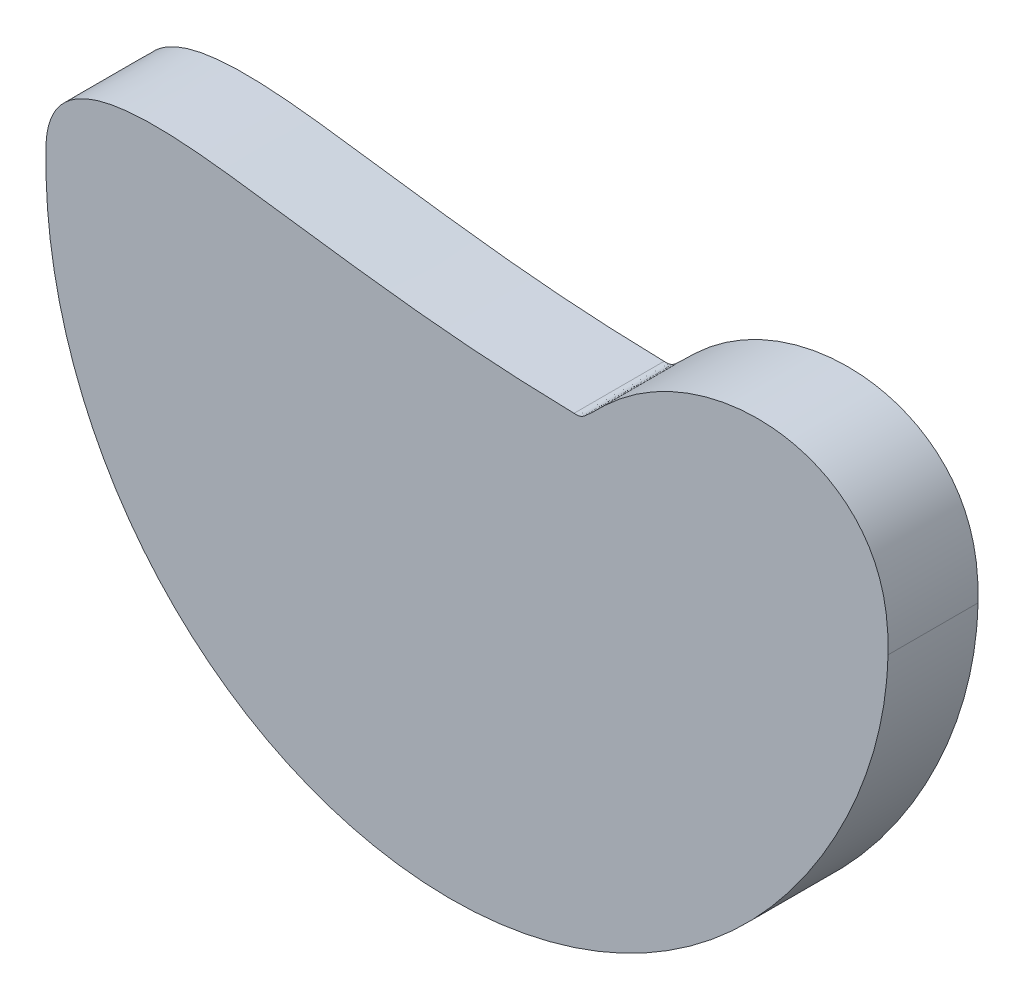
ISO-10303-21;
HEADER;
FILE_DESCRIPTION(('STEP AP214'),'2;1');
FILE_NAME('part.step','',(''),(''),'','','');
FILE_SCHEMA(('AUTOMOTIVE_DESIGN { 1 0 10303 214 1 1 1 1 }'));
ENDSEC;
DATA;
#1=APPLICATION_CONTEXT('core data for automotive mechanical design processes');
#2=APPLICATION_PROTOCOL_DEFINITION('international standard','automotive_design',2000,#1);
#3=PRODUCT_CONTEXT('',#1,'mechanical');
#4=PRODUCT('Part','Part','',(#3));
#5=PRODUCT_RELATED_PRODUCT_CATEGORY('part','',(#4));
#6=PRODUCT_DEFINITION_FORMATION('','',#4);
#7=PRODUCT_DEFINITION_CONTEXT('part definition',#1,'design');
#8=PRODUCT_DEFINITION('design','',#6,#7);
#9=PRODUCT_DEFINITION_SHAPE('','',#8);
#10=(LENGTH_UNIT() NAMED_UNIT(*) SI_UNIT(.MILLI.,.METRE.));
#11=(NAMED_UNIT(*) PLANE_ANGLE_UNIT() SI_UNIT($,.RADIAN.));
#12=(NAMED_UNIT(*) SI_UNIT($,.STERADIAN.) SOLID_ANGLE_UNIT());
#13=UNCERTAINTY_MEASURE_WITH_UNIT(LENGTH_MEASURE(1.E-05),#10,'distance_accuracy_value','');
#14=(GEOMETRIC_REPRESENTATION_CONTEXT(3) GLOBAL_UNCERTAINTY_ASSIGNED_CONTEXT((#13)) GLOBAL_UNIT_ASSIGNED_CONTEXT((#10,
#11,#12)) REPRESENTATION_CONTEXT('',''));
#15=CARTESIAN_POINT('',(0.,0.,0.));
#16=DIRECTION('',(0.,0.,1.));
#17=DIRECTION('',(1.,0.,0.));
#18=AXIS2_PLACEMENT_3D('',#15,#16,#17);
#19=CARTESIAN_POINT('',(0.177861844360574,9.82855438605498,20.));
#20=CARTESIAN_POINT('',(-24.6836923624119,10.4016354895508,20.));
#21=CARTESIAN_POINT('',(-51.7508193393782,13.9674637254268,20.));
#22=CARTESIAN_POINT('',(-116.674691622097,22.949464490572,20.));
#23=CARTESIAN_POINT('',(-117.145371573185,2.53030366212595,20.));
#24=B_SPLINE_CURVE_WITH_KNOTS('',3,(#19,#20,#21,#22,#23),.UNSPECIFIED.,.F.,.F.,(4,1,4),(0.,
0.578098364149226,1.),.UNSPECIFIED.);
#25=DIRECTION('',(0.,0.,-1.));
#26=VECTOR('',#25,1.);
#27=SURFACE_OF_LINEAR_EXTRUSION('',#24,#26);
#28=CARTESIAN_POINT('',(0.177861844360574,9.82855438605498,0.));
#29=CARTESIAN_POINT('',(-24.6836923624119,10.4016354895508,0.));
#30=CARTESIAN_POINT('',(-51.7508193393782,13.9674637254268,0.));
#31=CARTESIAN_POINT('',(-116.674691622097,22.949464490572,0.));
#32=CARTESIAN_POINT('',(-117.145371573185,2.53030366212595,0.));
#33=B_SPLINE_CURVE_WITH_KNOTS('',3,(#28,#29,#30,#31,#32),.UNSPECIFIED.,.F.,.F.,(4,1,4),(0.,
0.578098364149226,1.),.UNSPECIFIED.);
#34=CARTESIAN_POINT('',(0.177861842840825,9.82855438609001,0.));
#35=VERTEX_POINT('',#34);
#36=CARTESIAN_POINT('',(-117.145371573185,2.5303036621246,0.));
#37=VERTEX_POINT('',#36);
#38=EDGE_CURVE('E81',#35,#37,#33,.T.);
#39=ORIENTED_EDGE('',*,*,#38,.T.);
#40=DIRECTION('',(0.,0.,-1.));
#41=VECTOR('',#40,1.);
#42=CARTESIAN_POINT('',(-117.145371573185,2.5303036621246,20.));
#43=LINE('',#42,#41);
#44=CARTESIAN_POINT('',(-117.145371573185,2.5303036621246,20.));
#45=VERTEX_POINT('',#44);
#46=EDGE_CURVE('E11',#45,#37,#43,.T.);
#47=ORIENTED_EDGE('',*,*,#46,.F.);
#48=CARTESIAN_POINT('',(0.177861842840825,9.82855438609001,20.));
#49=VERTEX_POINT('',#48);
#50=EDGE_CURVE('E75',#49,#45,#24,.T.);
#51=ORIENTED_EDGE('',*,*,#50,.F.);
#52=DIRECTION('',(0.,0.,-1.));
#53=VECTOR('',#52,1.);
#54=CARTESIAN_POINT('',(0.177861842840825,9.82855438609001,20.));
#55=LINE('',#54,#53);
#56=EDGE_CURVE('E82',#49,#35,#55,.T.);
#57=ORIENTED_EDGE('',*,*,#56,.T.);
#58=EDGE_LOOP('',(#39,#47,#51,#57));
#59=FACE_BOUND('',#58,.T.);
#60=ADVANCED_FACE('F34',(#59),#27,.F.);
#61=CARTESIAN_POINT('',(-117.145371573185,2.5303036621246,20.));
#62=CARTESIAN_POINT('',(-117.148511626574,2.39408104441351,20.));
#63=CARTESIAN_POINT('',(-117.154264841567,2.1192397299448,20.));
#64=CARTESIAN_POINT('',(-117.163697582388,1.59627787590572,20.));
#65=CARTESIAN_POINT('',(-117.172306127851,0.919001208093309,20.));
#66=CARTESIAN_POINT('',(-117.177281387827,0.132679087831392,20.));
#67=CARTESIAN_POINT('',(-117.176524072155,-0.825004823361737,20.));
#68=CARTESIAN_POINT('',(-117.165431335051,-1.94736320312319,20.));
#69=CARTESIAN_POINT('',(-117.138383625471,-3.22414369874946,20.));
#70=CARTESIAN_POINT('',(-117.086762853282,-4.82314944663007,20.));
#71=CARTESIAN_POINT('',(-116.996001210809,-6.7389378139641,20.));
#72=CARTESIAN_POINT('',(-116.869036943858,-8.65391583544018,20.));
#73=CARTESIAN_POINT('',(-116.705494671698,-10.5652891244244,20.));
#74=CARTESIAN_POINT('',(-116.544690829488,-12.1561342168004,20.));
#75=CARTESIAN_POINT('',(-116.401268409165,-13.4270526002276,20.));
#76=CARTESIAN_POINT('',(-116.203453629686,-15.0136139345994,20.));
#77=CARTESIAN_POINT('',(-115.847254127427,-17.5468613935864,20.));
#78=CARTESIAN_POINT('',(-115.261475868583,-21.0158449663186,20.));
#79=CARTESIAN_POINT('',(-114.339794952761,-25.3982998589919,20.));
#80=CARTESIAN_POINT('',(-113.042751796319,-30.3493997291294,20.));
#81=CARTESIAN_POINT('',(-111.11524792372,-36.4499425298728,20.));
#82=CARTESIAN_POINT('',(-108.311650776112,-43.6019706937092,20.));
#83=CARTESIAN_POINT('',(-104.852483459012,-50.5808474744863,20.));
#84=CARTESIAN_POINT('',(-100.726369639083,-57.299764402907,20.));
#85=CARTESIAN_POINT('',(-96.8577535124118,-62.6471979481881,20.));
#86=CARTESIAN_POINT('',(-93.4941562289455,-66.769152190083,20.));
#87=CARTESIAN_POINT('',(-89.1034382059167,-71.5607866391351,20.));
#88=CARTESIAN_POINT('',(-83.5014283516271,-76.8197706383303,20.));
#89=CARTESIAN_POINT('',(-76.4225285008715,-82.2966956542939,20.));
#90=CARTESIAN_POINT('',(-67.6803785485982,-87.5706372858913,20.));
#91=CARTESIAN_POINT('',(-58.4048012555426,-91.7829419705361,20.));
#92=CARTESIAN_POINT('',(-48.7223687681381,-94.8768956492595,20.));
#93=CARTESIAN_POINT('',(-38.7442047943013,-96.8158220944584,20.));
#94=CARTESIAN_POINT('',(-28.6078236695162,-97.5737254343747,20.));
#95=CARTESIAN_POINT('',(-18.4524590333943,-97.1455836640084,20.));
#96=CARTESIAN_POINT('',(-8.41499842047297,-95.5474950144924,20.));
#97=CARTESIAN_POINT('',(1.55488734690901,-92.7657414789562,20.));
#98=CARTESIAN_POINT('',(11.141033668992,-88.8597905567207,20.));
#99=CARTESIAN_POINT('',(20.2300266513762,-83.9088988614011,20.));
#100=CARTESIAN_POINT('',(28.7299568498749,-78.0088023546873,20.));
#101=CARTESIAN_POINT('',(36.4477073206841,-71.4042715296886,20.));
#102=CARTESIAN_POINT('',(42.6140141683611,-65.0050263480889,20.));
#103=CARTESIAN_POINT('',(47.4645815407915,-59.1387528495799,20.));
#104=CARTESIAN_POINT('',(51.2105804800001,-54.0232160989622,20.));
#105=CARTESIAN_POINT('',(54.0263982173139,-49.8042722356331,20.));
#106=CARTESIAN_POINT('',(56.6962065747388,-45.4025010744626,20.));
#107=CARTESIAN_POINT('',(59.2038881242372,-40.8195914910713,20.));
#108=CARTESIAN_POINT('',(61.5295844977051,-36.0569028345028,20.));
#109=CARTESIAN_POINT('',(63.3833926897456,-31.7333683218089,20.));
#110=CARTESIAN_POINT('',(64.8105031063494,-27.9628083245626,20.));
#111=CARTESIAN_POINT('',(65.8906939374982,-24.7625754192715,20.));
#112=CARTESIAN_POINT('',(66.6882470080186,-22.1576743122844,20.));
#113=CARTESIAN_POINT('',(67.4129405040974,-19.512366458509,20.));
#114=CARTESIAN_POINT('',(68.0593125167494,-16.8278485099444,20.));
#115=CARTESIAN_POINT('',(68.6186418619358,-14.1237638543277,20.));
#116=CARTESIAN_POINT('',(69.0284293178725,-11.7426576093209,20.));
#117=CARTESIAN_POINT('',(69.320294156649,-9.69238753530009,20.));
#118=CARTESIAN_POINT('',(69.5226596173193,-7.97885398273961,20.));
#119=CARTESIAN_POINT('',(69.6424390647765,-6.77659381024059,20.));
#120=CARTESIAN_POINT('',(69.7291447703733,-5.7453976406726,20.));
#121=CARTESIAN_POINT('',(69.7906323453731,-4.88448746925579,20.));
#122=CARTESIAN_POINT('',(69.8280105151417,-4.27918351863341,20.));
#123=CARTESIAN_POINT('',(69.8557330231699,-3.76857536068871,20.));
#124=CARTESIAN_POINT('',(69.876103692273,-3.3414194165968,20.));
#125=CARTESIAN_POINT('',(69.8909779634967,-2.98898897827904,20.));
#126=CARTESIAN_POINT('',(69.9079292514736,-2.52875846418237,20.));
#127=CARTESIAN_POINT('',(69.9195551826631,-2.14713319056543,20.));
#128=CARTESIAN_POINT('',(69.9254355381793,-1.92894384103821,20.));
#129=CARTESIAN_POINT('',(69.9288244733705,-1.78192416780154,20.));
#130=B_SPLINE_CURVE_WITH_KNOTS('',4,(#61,#62,#63,#64,#65,#66,#67,#68,#69,#70,#71,#72,#73,#74,
#75,#76,#77,#78,#79,#80,#81,#82,#83,#84,#85,#86,#87,#88,#89,#90,#91,#92,#93,#94,#95,#96,#97,#98,
#99,#100,#101,#102,#103,#104,#105,#106,#107,#108,#109,#110,#111,#112,#113,#114,#115,#116,#117,
#118,#119,#120,#121,#122,#123,#124,#125,#126,#127,#128,#129),.UNSPECIFIED.,.F.,.F.,(5,1,1,1,1,1,
1,1,1,1,1,1,1,1,1,1,1,1,1,1,1,1,1,1,1,1,1,1,1,1,1,1,1,1,1,1,1,1,1,1,1,1,1,1,1,1,1,1,1,1,1,1,1,1,
1,1,1,1,1,1,1,1,1,1,1,5),(0.0625046681183283,0.0643240058410457,0.0661433435637631,
0.0679626812864804,0.0697820190091978,0.0734206944546325,0.0770593699000672,0.080698045345502,
0.0843367207909367,0.091614071681806,0.0988914225726754,0.10253009801811,0.106168773463545,
0.10980744890898,0.113446124354414,0.120723475245284,0.135278176387059,0.149832877528835,
0.16438757867061,0.178942279812386,0.208051689640416,0.237161099468446,0.252860165025411,
0.268559230582375,0.283113932265002,0.297668633947629,0.326778066552008,0.355887443027896,
0.384738803460664,0.413590223181368,0.442441544870212,0.47129288514693,0.500144203054237,
0.528995519014211,0.557846989896702,0.586698245934404,0.61767888828549,0.64653020825388,
0.67538152822227,0.704232838083283,0.733084147944296,0.747509790836187,0.761935433728078,
0.776361076619968,0.790786719511859,0.806075028070559,0.821363336629258,0.836651645187958,
0.844295799467307,0.851939953746657,0.859794103838006,0.867648253929355,0.875502404020704,
0.883356554112053,0.891210710562719,0.895137788788052,0.899064867013385,0.902991945238718,
0.904955484351384,0.906919023464051,0.908882562576717,0.90986433213305,0.910846101689383,
0.911827871245717,0.91280964080205,0.914773179943921),.UNSPECIFIED.);
#131=DIRECTION('',(0.,0.,-1.));
#132=VECTOR('',#131,1.);
#133=SURFACE_OF_LINEAR_EXTRUSION('',#130,#132);
#134=CARTESIAN_POINT('',(-117.145371573185,2.5303036621246,0.));
#135=CARTESIAN_POINT('',(-117.148511626574,2.39408104441351,0.));
#136=CARTESIAN_POINT('',(-117.154264841567,2.1192397299448,0.));
#137=CARTESIAN_POINT('',(-117.163697582388,1.59627787590572,0.));
#138=CARTESIAN_POINT('',(-117.172306127851,0.919001208093309,0.));
#139=CARTESIAN_POINT('',(-117.177281387827,0.132679087831392,0.));
#140=CARTESIAN_POINT('',(-117.176524072155,-0.825004823361737,0.));
#141=CARTESIAN_POINT('',(-117.165431335051,-1.94736320312319,0.));
#142=CARTESIAN_POINT('',(-117.138383625471,-3.22414369874946,0.));
#143=CARTESIAN_POINT('',(-117.086762853282,-4.82314944663007,0.));
#144=CARTESIAN_POINT('',(-116.996001210809,-6.7389378139641,0.));
#145=CARTESIAN_POINT('',(-116.869036943858,-8.65391583544018,0.));
#146=CARTESIAN_POINT('',(-116.705494671698,-10.5652891244244,0.));
#147=CARTESIAN_POINT('',(-116.544690829488,-12.1561342168004,0.));
#148=CARTESIAN_POINT('',(-116.401268409165,-13.4270526002276,0.));
#149=CARTESIAN_POINT('',(-116.203453629686,-15.0136139345994,0.));
#150=CARTESIAN_POINT('',(-115.847254127427,-17.5468613935864,0.));
#151=CARTESIAN_POINT('',(-115.261475868583,-21.0158449663186,0.));
#152=CARTESIAN_POINT('',(-114.339794952761,-25.3982998589919,0.));
#153=CARTESIAN_POINT('',(-113.042751796319,-30.3493997291294,0.));
#154=CARTESIAN_POINT('',(-111.11524792372,-36.4499425298728,0.));
#155=CARTESIAN_POINT('',(-108.311650776112,-43.6019706937092,0.));
#156=CARTESIAN_POINT('',(-104.852483459012,-50.5808474744863,0.));
#157=CARTESIAN_POINT('',(-100.726369639083,-57.299764402907,0.));
#158=CARTESIAN_POINT('',(-96.8577535124118,-62.6471979481881,0.));
#159=CARTESIAN_POINT('',(-93.4941562289455,-66.769152190083,0.));
#160=CARTESIAN_POINT('',(-89.1034382059167,-71.5607866391351,0.));
#161=CARTESIAN_POINT('',(-83.5014283516271,-76.8197706383303,0.));
#162=CARTESIAN_POINT('',(-76.4225285008715,-82.2966956542939,0.));
#163=CARTESIAN_POINT('',(-67.6803785485982,-87.5706372858913,0.));
#164=CARTESIAN_POINT('',(-58.4048012555426,-91.7829419705361,0.));
#165=CARTESIAN_POINT('',(-48.7223687681381,-94.8768956492595,0.));
#166=CARTESIAN_POINT('',(-38.7442047943013,-96.8158220944584,0.));
#167=CARTESIAN_POINT('',(-28.6078236695162,-97.5737254343747,0.));
#168=CARTESIAN_POINT('',(-18.4524590333943,-97.1455836640084,0.));
#169=CARTESIAN_POINT('',(-8.41499842047297,-95.5474950144924,0.));
#170=CARTESIAN_POINT('',(1.55488734690901,-92.7657414789562,0.));
#171=CARTESIAN_POINT('',(11.141033668992,-88.8597905567207,0.));
#172=CARTESIAN_POINT('',(20.2300266513762,-83.9088988614011,0.));
#173=CARTESIAN_POINT('',(28.7299568498749,-78.0088023546873,0.));
#174=CARTESIAN_POINT('',(36.4477073206841,-71.4042715296886,0.));
#175=CARTESIAN_POINT('',(42.6140141683611,-65.0050263480889,0.));
#176=CARTESIAN_POINT('',(47.4645815407915,-59.1387528495799,0.));
#177=CARTESIAN_POINT('',(51.2105804800001,-54.0232160989622,0.));
#178=CARTESIAN_POINT('',(54.0263982173139,-49.8042722356331,0.));
#179=CARTESIAN_POINT('',(56.6962065747388,-45.4025010744626,0.));
#180=CARTESIAN_POINT('',(59.2038881242372,-40.8195914910713,0.));
#181=CARTESIAN_POINT('',(61.5295844977051,-36.0569028345028,0.));
#182=CARTESIAN_POINT('',(63.3833926897456,-31.7333683218089,0.));
#183=CARTESIAN_POINT('',(64.8105031063494,-27.9628083245626,0.));
#184=CARTESIAN_POINT('',(65.8906939374982,-24.7625754192715,0.));
#185=CARTESIAN_POINT('',(66.6882470080186,-22.1576743122844,0.));
#186=CARTESIAN_POINT('',(67.4129405040974,-19.512366458509,0.));
#187=CARTESIAN_POINT('',(68.0593125167494,-16.8278485099444,0.));
#188=CARTESIAN_POINT('',(68.6186418619358,-14.1237638543277,0.));
#189=CARTESIAN_POINT('',(69.0284293178725,-11.7426576093209,0.));
#190=CARTESIAN_POINT('',(69.320294156649,-9.69238753530009,0.));
#191=CARTESIAN_POINT('',(69.5226596173193,-7.97885398273961,0.));
#192=CARTESIAN_POINT('',(69.6424390647765,-6.77659381024059,0.));
#193=CARTESIAN_POINT('',(69.7291447703733,-5.7453976406726,0.));
#194=CARTESIAN_POINT('',(69.7906323453731,-4.88448746925579,0.));
#195=CARTESIAN_POINT('',(69.8280105151417,-4.27918351863341,0.));
#196=CARTESIAN_POINT('',(69.8557330231699,-3.76857536068871,0.));
#197=CARTESIAN_POINT('',(69.876103692273,-3.3414194165968,0.));
#198=CARTESIAN_POINT('',(69.8909779634967,-2.98898897827904,0.));
#199=CARTESIAN_POINT('',(69.9079292514736,-2.52875846418237,0.));
#200=CARTESIAN_POINT('',(69.9195551826631,-2.14713319056543,0.));
#201=CARTESIAN_POINT('',(69.9254355381793,-1.92894384103821,0.));
#202=CARTESIAN_POINT('',(69.9288244733705,-1.78192416780154,0.));
#203=B_SPLINE_CURVE_WITH_KNOTS('',4,(#134,#135,#136,#137,#138,#139,#140,#141,#142,#143,#144,
#145,#146,#147,#148,#149,#150,#151,#152,#153,#154,#155,#156,#157,#158,#159,#160,#161,#162,#163,
#164,#165,#166,#167,#168,#169,#170,#171,#172,#173,#174,#175,#176,#177,#178,#179,#180,#181,#182,
#183,#184,#185,#186,#187,#188,#189,#190,#191,#192,#193,#194,#195,#196,#197,#198,#199,#200,#201,
#202),.UNSPECIFIED.,.F.,.F.,(5,1,1,1,1,1,1,1,1,1,1,1,1,1,1,1,1,1,1,1,1,1,1,1,1,1,1,1,1,1,1,1,1,
1,1,1,1,1,1,1,1,1,1,1,1,1,1,1,1,1,1,1,1,1,1,1,1,1,1,1,1,1,1,1,1,5),(0.0625046681183283,
0.0643240058410457,0.0661433435637631,0.0679626812864804,0.0697820190091978,0.0734206944546325,
0.0770593699000672,0.080698045345502,0.0843367207909367,0.091614071681806,0.0988914225726754,
0.10253009801811,0.106168773463545,0.10980744890898,0.113446124354414,0.120723475245284,
0.135278176387059,0.149832877528835,0.16438757867061,0.178942279812386,0.208051689640416,
0.237161099468446,0.252860165025411,0.268559230582375,0.283113932265002,0.297668633947629,
0.326778066552008,0.355887443027896,0.384738803460664,0.413590223181368,0.442441544870212,
0.47129288514693,0.500144203054237,0.528995519014211,0.557846989896702,0.586698245934404,
0.61767888828549,0.64653020825388,0.67538152822227,0.704232838083283,0.733084147944296,
0.747509790836187,0.761935433728078,0.776361076619968,0.790786719511859,0.806075028070559,
0.821363336629258,0.836651645187958,0.844295799467307,0.851939953746657,0.859794103838006,
0.867648253929355,0.875502404020704,0.883356554112053,0.891210710562719,0.895137788788052,
0.899064867013385,0.902991945238718,0.904955484351384,0.906919023464051,0.908882562576717,
0.90986433213305,0.910846101689383,0.911827871245717,0.91280964080205,0.914773179943921),.UNSPECIFIED.);
#204=CARTESIAN_POINT('',(69.9288244735456,-1.78192416020501,0.));
#205=VERTEX_POINT('',#204);
#206=EDGE_CURVE('E63',#37,#205,#203,.T.);
#207=ORIENTED_EDGE('',*,*,#206,.T.);
#208=DIRECTION('',(0.,0.,-1.));
#209=VECTOR('',#208,1.);
#210=CARTESIAN_POINT('',(69.9288244735456,-1.78192416020501,20.));
#211=LINE('',#210,#209);
#212=CARTESIAN_POINT('',(69.9288244735456,-1.78192416020501,20.));
#213=VERTEX_POINT('',#212);
#214=EDGE_CURVE('E43',#213,#205,#211,.T.);
#215=ORIENTED_EDGE('',*,*,#214,.F.);
#216=EDGE_CURVE('E71',#45,#213,#130,.T.);
#217=ORIENTED_EDGE('',*,*,#216,.F.);
#218=ORIENTED_EDGE('',*,*,#46,.T.);
#219=EDGE_LOOP('',(#207,#215,#217,#218));
#220=FACE_BOUND('',#219,.T.);
#221=ADVANCED_FACE('F72',(#220),#133,.F.);
#222=CARTESIAN_POINT('',(69.9288244735456,-1.78192416020501,20.));
#223=CARTESIAN_POINT('',(69.9332911843817,-1.58814814162355,20.));
#224=CARTESIAN_POINT('',(69.9401865786102,-1.21148588894626,20.));
#225=CARTESIAN_POINT('',(69.9504905748768,-0.403048983436677,20.));
#226=CARTESIAN_POINT('',(69.9439566897417,0.335793809860798,20.));
#227=CARTESIAN_POINT('',(69.9285103838359,1.27818998227315,20.));
#228=CARTESIAN_POINT('',(69.895507147218,2.09841754531504,20.));
#229=CARTESIAN_POINT('',(69.8482805797,2.98971999964633,20.));
#230=CARTESIAN_POINT('',(69.7831356594744,3.83950044422006,20.));
#231=CARTESIAN_POINT('',(69.6796905641354,4.92475244759297,20.));
#232=CARTESIAN_POINT('',(69.5170008373204,6.20961244221611,20.));
#233=CARTESIAN_POINT('',(69.2671497770648,7.70823401266261,20.));
#234=CARTESIAN_POINT('',(68.8915009309566,9.39875328626659,20.));
#235=CARTESIAN_POINT('',(68.3949433709165,11.154591345936,20.));
#236=CARTESIAN_POINT('',(67.7539623415948,12.9583068881517,20.));
#237=CARTESIAN_POINT('',(66.9805922900269,14.7107242475239,20.));
#238=CARTESIAN_POINT('',(66.0728253012427,16.3967969618862,20.));
#239=CARTESIAN_POINT('',(65.0890617155771,17.9332486166983,20.));
#240=CARTESIAN_POINT('',(64.0514095607218,19.3224231235014,20.));
#241=CARTESIAN_POINT('',(62.6716030002612,20.9149027172361,20.));
#242=CARTESIAN_POINT('',(61.1345767528531,22.3872813086835,20.));
#243=CARTESIAN_POINT('',(59.4532845682983,23.723457164788,20.));
#244=CARTESIAN_POINT('',(57.3486935644192,25.1072592694925,20.));
#245=CARTESIAN_POINT('',(55.130210414913,26.3036439756193,20.));
#246=CARTESIAN_POINT('',(51.729921898373,27.7212057116742,20.));
#247=CARTESIAN_POINT('',(47.0258422424612,28.9266660845175,20.));
#248=CARTESIAN_POINT('',(42.1854435493933,29.3697080443411,20.));
#249=CARTESIAN_POINT('',(37.344141174608,29.1469865362923,20.));
#250=CARTESIAN_POINT('',(33.3538694666155,28.5597907188236,20.));
#251=CARTESIAN_POINT('',(30.2034634073885,27.8644713612863,20.));
#252=CARTESIAN_POINT('',(27.1075906906732,26.9571908005715,20.));
#253=CARTESIAN_POINT('',(24.4563790580333,25.988505794773,20.));
#254=CARTESIAN_POINT('',(21.8606138565669,24.8819084785711,20.));
#255=CARTESIAN_POINT('',(19.6877105462189,23.8196565493569,20.));
#256=CARTESIAN_POINT('',(17.5599213707186,22.6697648689706,20.));
#257=CARTESIAN_POINT('',(15.4927481327558,21.4141764231377,20.));
#258=CARTESIAN_POINT('',(13.8132978596205,20.2998830417086,20.));
#259=CARTESIAN_POINT('',(12.1796031642046,19.1202113418023,20.));
#260=CARTESIAN_POINT('',(10.9010148880497,18.1383929854576,20.));
#261=CARTESIAN_POINT('',(9.65150621029232,17.1198376079304,20.));
#262=CARTESIAN_POINT('',(8.58389778102186,16.1979767515049,20.));
#263=CARTESIAN_POINT('',(7.68687460470307,15.3874728641154,20.));
#264=CARTESIAN_POINT('',(6.95071076635379,14.6997542355876,20.));
#265=CARTESIAN_POINT('',(6.3681072040291,14.1428869767442,20.));
#266=CARTESIAN_POINT('',(5.79105704564894,13.5802771688519,20.));
#267=CARTESIAN_POINT('',(5.2898888609515,13.0841784259386,20.));
#268=CARTESIAN_POINT('',(4.86173320668141,12.6575371063632,20.));
#269=CARTESIAN_POINT('',(4.50983858990301,12.3071503378398,20.));
#270=CARTESIAN_POINT('',(4.23378316837947,12.0334805437627,20.));
#271=CARTESIAN_POINT('',(3.96149360305578,11.7660745717244,20.));
#272=CARTESIAN_POINT('',(3.692379951369,11.5056849219027,20.));
#273=CARTESIAN_POINT('',(3.42008290706285,11.2484730606371,20.));
#274=CARTESIAN_POINT('',(3.14351606296764,10.996058579481,20.));
#275=CARTESIAN_POINT('',(2.86021497351314,10.7508292979996,20.));
#276=CARTESIAN_POINT('',(2.56830446208795,10.516375172383,20.));
#277=CARTESIAN_POINT('',(2.29840316967437,10.3235935908836,20.));
#278=CARTESIAN_POINT('',(2.0538401750169,10.1724635905067,20.));
#279=CARTESIAN_POINT('',(1.83572934714364,10.0601441031335,20.));
#280=CARTESIAN_POINT('',(1.65295252887698,9.98024502819047,20.));
#281=CARTESIAN_POINT('',(1.43595396283192,9.90750259661512,20.));
#282=CARTESIAN_POINT('',(1.19978478441283,9.85055163172477,20.));
#283=CARTESIAN_POINT('',(0.913287249729207,9.81926367228265,20.));
#284=CARTESIAN_POINT('',(0.643013267760071,9.81374125307244,20.));
#285=CARTESIAN_POINT('',(0.372845449423486,9.82258098526977,20.));
#286=CARTESIAN_POINT('',(0.244498162818904,9.82701835921277,20.));
#287=CARTESIAN_POINT('',(0.177861842840825,9.82855438609001,20.));
#288=B_SPLINE_CURVE_WITH_KNOTS('',4,(#222,#223,#224,#225,#226,#227,#228,#229,#230,#231,#232,
#233,#234,#235,#236,#237,#238,#239,#240,#241,#242,#243,#244,#245,#246,#247,#248,#249,#250,#251,
#252,#253,#254,#255,#256,#257,#258,#259,#260,#261,#262,#263,#264,#265,#266,#267,#268,#269,#270,
#271,#272,#273,#274,#275,#276,#277,#278,#279,#280,#281,#282,#283,#284,#285,#286,#287),
.UNSPECIFIED.,.F.,.F.,(5,1,1,1,1,1,1,1,1,1,1,1,1,1,1,1,1,1,1,1,1,1,1,1,1,1,1,1,1,1,1,1,1,1,1,1,
1,1,1,1,1,1,1,1,1,1,1,1,1,1,1,1,1,1,1,1,1,1,1,1,1,1,5),(0.0154492760684607,0.0236244177175265,
0.0317995593665923,0.039974701015658,0.0481498426647239,0.0563249843137897,0.0645001259628555,
0.0726752676119212,0.0808504092609871,0.0972006877619961,0.113550966263005,0.129901244764014,
0.146251523265023,0.166012297621732,0.18577307197844,0.202123324137839,0.218473576297238,
0.234823927520141,0.251174278743045,0.281598152597995,0.298677543565932,0.315756934533869,
0.34618100789579,0.376605081257711,0.437453093824662,0.498301234475854,0.528725284730747,
0.55914933498564,0.58957338274188,0.61999743049812,0.650421560049034,0.665633624824492,
0.696057711182514,0.711269732765079,0.741693775930209,0.75690575545769,0.77211773498517,
0.787329714512651,0.802541694040132,0.817753663942292,0.825359648893372,0.832965633844453,
0.840571618795533,0.848177603746613,0.855783588697693,0.859586581173233,0.863389573648773,
0.866923978309336,0.870458382969898,0.87399278763046,0.877527192291022,0.881061596951584,
0.884596001612147,0.888130406272709,0.891664810933271,0.893561165992139,0.895457521051008,
0.897353876109876,0.899250231168744,0.902061525147068,0.904872819125393,0.907684113103717,
0.910495407064231),.UNSPECIFIED.);
#289=DIRECTION('',(0.,0.,-1.));
#290=VECTOR('',#289,1.);
#291=SURFACE_OF_LINEAR_EXTRUSION('',#288,#290);
#292=CARTESIAN_POINT('',(69.9288244735456,-1.78192416020501,0.));
#293=CARTESIAN_POINT('',(69.9332911843817,-1.58814814162355,0.));
#294=CARTESIAN_POINT('',(69.9401865786102,-1.21148588894626,0.));
#295=CARTESIAN_POINT('',(69.9504905748768,-0.403048983436677,0.));
#296=CARTESIAN_POINT('',(69.9439566897417,0.335793809860798,0.));
#297=CARTESIAN_POINT('',(69.9285103838359,1.27818998227315,0.));
#298=CARTESIAN_POINT('',(69.895507147218,2.09841754531504,0.));
#299=CARTESIAN_POINT('',(69.8482805797,2.98971999964633,0.));
#300=CARTESIAN_POINT('',(69.7831356594744,3.83950044422006,0.));
#301=CARTESIAN_POINT('',(69.6796905641354,4.92475244759297,0.));
#302=CARTESIAN_POINT('',(69.5170008373204,6.20961244221611,0.));
#303=CARTESIAN_POINT('',(69.2671497770648,7.70823401266261,0.));
#304=CARTESIAN_POINT('',(68.8915009309566,9.39875328626659,0.));
#305=CARTESIAN_POINT('',(68.3949433709165,11.154591345936,0.));
#306=CARTESIAN_POINT('',(67.7539623415948,12.9583068881517,0.));
#307=CARTESIAN_POINT('',(66.9805922900269,14.7107242475239,0.));
#308=CARTESIAN_POINT('',(66.0728253012427,16.3967969618862,0.));
#309=CARTESIAN_POINT('',(65.0890617155771,17.9332486166983,0.));
#310=CARTESIAN_POINT('',(64.0514095607218,19.3224231235014,0.));
#311=CARTESIAN_POINT('',(62.6716030002612,20.9149027172361,0.));
#312=CARTESIAN_POINT('',(61.1345767528531,22.3872813086835,0.));
#313=CARTESIAN_POINT('',(59.4532845682983,23.723457164788,0.));
#314=CARTESIAN_POINT('',(57.3486935644192,25.1072592694925,0.));
#315=CARTESIAN_POINT('',(55.130210414913,26.3036439756193,0.));
#316=CARTESIAN_POINT('',(51.729921898373,27.7212057116742,0.));
#317=CARTESIAN_POINT('',(47.0258422424612,28.9266660845175,0.));
#318=CARTESIAN_POINT('',(42.1854435493933,29.3697080443411,0.));
#319=CARTESIAN_POINT('',(37.344141174608,29.1469865362923,0.));
#320=CARTESIAN_POINT('',(33.3538694666155,28.5597907188236,0.));
#321=CARTESIAN_POINT('',(30.2034634073885,27.8644713612863,0.));
#322=CARTESIAN_POINT('',(27.1075906906732,26.9571908005715,0.));
#323=CARTESIAN_POINT('',(24.4563790580333,25.988505794773,0.));
#324=CARTESIAN_POINT('',(21.8606138565669,24.8819084785711,0.));
#325=CARTESIAN_POINT('',(19.6877105462189,23.8196565493569,0.));
#326=CARTESIAN_POINT('',(17.5599213707186,22.6697648689706,0.));
#327=CARTESIAN_POINT('',(15.4927481327558,21.4141764231377,0.));
#328=CARTESIAN_POINT('',(13.8132978596205,20.2998830417086,0.));
#329=CARTESIAN_POINT('',(12.1796031642046,19.1202113418023,0.));
#330=CARTESIAN_POINT('',(10.9010148880497,18.1383929854576,0.));
#331=CARTESIAN_POINT('',(9.65150621029232,17.1198376079304,0.));
#332=CARTESIAN_POINT('',(8.58389778102186,16.1979767515049,0.));
#333=CARTESIAN_POINT('',(7.68687460470307,15.3874728641154,0.));
#334=CARTESIAN_POINT('',(6.95071076635379,14.6997542355876,0.));
#335=CARTESIAN_POINT('',(6.3681072040291,14.1428869767442,0.));
#336=CARTESIAN_POINT('',(5.79105704564894,13.5802771688519,0.));
#337=CARTESIAN_POINT('',(5.2898888609515,13.0841784259386,0.));
#338=CARTESIAN_POINT('',(4.86173320668141,12.6575371063632,0.));
#339=CARTESIAN_POINT('',(4.50983858990301,12.3071503378398,0.));
#340=CARTESIAN_POINT('',(4.23378316837947,12.0334805437627,0.));
#341=CARTESIAN_POINT('',(3.96149360305578,11.7660745717244,0.));
#342=CARTESIAN_POINT('',(3.692379951369,11.5056849219027,0.));
#343=CARTESIAN_POINT('',(3.42008290706285,11.2484730606371,0.));
#344=CARTESIAN_POINT('',(3.14351606296764,10.996058579481,0.));
#345=CARTESIAN_POINT('',(2.86021497351314,10.7508292979996,0.));
#346=CARTESIAN_POINT('',(2.56830446208795,10.516375172383,0.));
#347=CARTESIAN_POINT('',(2.29840316967437,10.3235935908836,0.));
#348=CARTESIAN_POINT('',(2.0538401750169,10.1724635905067,0.));
#349=CARTESIAN_POINT('',(1.83572934714364,10.0601441031335,0.));
#350=CARTESIAN_POINT('',(1.65295252887698,9.98024502819047,0.));
#351=CARTESIAN_POINT('',(1.43595396283192,9.90750259661512,0.));
#352=CARTESIAN_POINT('',(1.19978478441283,9.85055163172477,0.));
#353=CARTESIAN_POINT('',(0.913287249729207,9.81926367228265,0.));
#354=CARTESIAN_POINT('',(0.643013267760071,9.81374125307244,0.));
#355=CARTESIAN_POINT('',(0.372845449423486,9.82258098526977,0.));
#356=CARTESIAN_POINT('',(0.244498162818904,9.82701835921277,0.));
#357=CARTESIAN_POINT('',(0.177861842840825,9.82855438609001,0.));
#358=B_SPLINE_CURVE_WITH_KNOTS('',4,(#292,#293,#294,#295,#296,#297,#298,#299,#300,#301,#302,
#303,#304,#305,#306,#307,#308,#309,#310,#311,#312,#313,#314,#315,#316,#317,#318,#319,#320,#321,
#322,#323,#324,#325,#326,#327,#328,#329,#330,#331,#332,#333,#334,#335,#336,#337,#338,#339,#340,
#341,#342,#343,#344,#345,#346,#347,#348,#349,#350,#351,#352,#353,#354,#355,#356,#357),
.UNSPECIFIED.,.F.,.F.,(5,1,1,1,1,1,1,1,1,1,1,1,1,1,1,1,1,1,1,1,1,1,1,1,1,1,1,1,1,1,1,1,1,1,1,1,
1,1,1,1,1,1,1,1,1,1,1,1,1,1,1,1,1,1,1,1,1,1,1,1,1,1,5),(0.0154492760684607,0.0236244177175265,
0.0317995593665923,0.039974701015658,0.0481498426647239,0.0563249843137897,0.0645001259628555,
0.0726752676119212,0.0808504092609871,0.0972006877619961,0.113550966263005,0.129901244764014,
0.146251523265023,0.166012297621732,0.18577307197844,0.202123324137839,0.218473576297238,
0.234823927520141,0.251174278743045,0.281598152597995,0.298677543565932,0.315756934533869,
0.34618100789579,0.376605081257711,0.437453093824662,0.498301234475854,0.528725284730747,
0.55914933498564,0.58957338274188,0.61999743049812,0.650421560049034,0.665633624824492,
0.696057711182514,0.711269732765079,0.741693775930209,0.75690575545769,0.77211773498517,
0.787329714512651,0.802541694040132,0.817753663942292,0.825359648893372,0.832965633844453,
0.840571618795533,0.848177603746613,0.855783588697693,0.859586581173233,0.863389573648773,
0.866923978309336,0.870458382969898,0.87399278763046,0.877527192291022,0.881061596951584,
0.884596001612147,0.888130406272709,0.891664810933271,0.893561165992139,0.895457521051008,
0.897353876109876,0.899250231168744,0.902061525147068,0.904872819125393,0.907684113103717,
0.910495407064231),.UNSPECIFIED.);
#359=EDGE_CURVE('E68',#205,#35,#358,.T.);
#360=ORIENTED_EDGE('',*,*,#359,.T.);
#361=ORIENTED_EDGE('',*,*,#56,.F.);
#362=EDGE_CURVE('E51',#213,#49,#288,.T.);
#363=ORIENTED_EDGE('',*,*,#362,.F.);
#364=ORIENTED_EDGE('',*,*,#214,.T.);
#365=EDGE_LOOP('',(#360,#361,#363,#364));
#366=FACE_BOUND('',#365,.T.);
#367=ADVANCED_FACE('F107',(#366),#291,.F.);
#368=CARTESIAN_POINT('',(-57.7998222031952,14.8637662413492,20.));
#369=DIRECTION('',(0.,0.,1.));
#370=DIRECTION('',(1.,0.,0.));
#371=AXIS2_PLACEMENT_3D('',#368,#369,#370);
#372=PLANE('',#371);
#373=ORIENTED_EDGE('',*,*,#50,.T.);
#374=ORIENTED_EDGE('',*,*,#216,.T.);
#375=ORIENTED_EDGE('',*,*,#362,.T.);
#376=EDGE_LOOP('',(#373,#374,#375));
#377=FACE_BOUND('',#376,.T.);
#378=ADVANCED_FACE('F78',(#377),#372,.T.);
#379=CARTESIAN_POINT('',(-57.7998222031952,14.8637662413492,0.));
#380=DIRECTION('',(0.,0.,1.));
#381=DIRECTION('',(1.,0.,0.));
#382=AXIS2_PLACEMENT_3D('',#379,#380,#381);
#383=PLANE('',#382);
#384=ORIENTED_EDGE('',*,*,#38,.F.);
#385=ORIENTED_EDGE('',*,*,#359,.F.);
#386=ORIENTED_EDGE('',*,*,#206,.F.);
#387=EDGE_LOOP('',(#384,#385,#386));
#388=FACE_BOUND('',#387,.T.);
#389=ADVANCED_FACE('F108',(#388),#383,.F.);
#390=CLOSED_SHELL('',(#60,#221,#367,#378,#389));
#391=MANIFOLD_SOLID_BREP('B2',#390);
#392=ADVANCED_BREP_SHAPE_REPRESENTATION('',(#18,#391),#14);
#393=SHAPE_DEFINITION_REPRESENTATION(#9,#392);
ENDSEC;
END-ISO-10303-21;
